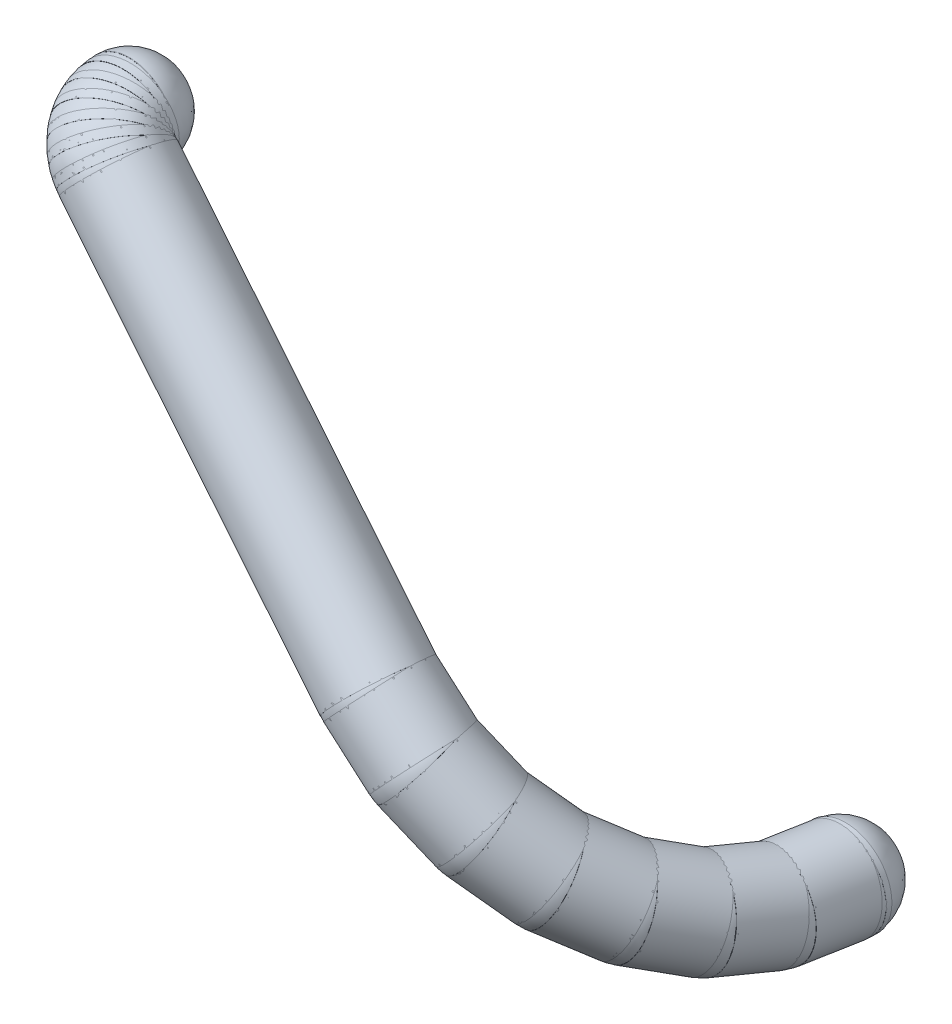
ISO-10303-21;
HEADER;
FILE_DESCRIPTION(('STEP AP214'),'2;1');
FILE_NAME('part.step','',(''),(''),'','','');
FILE_SCHEMA(('AUTOMOTIVE_DESIGN { 1 0 10303 214 1 1 1 1 }'));
ENDSEC;
DATA;
#1=APPLICATION_CONTEXT('core data for automotive mechanical design processes');
#2=APPLICATION_PROTOCOL_DEFINITION('international standard','automotive_design',2000,#1);
#3=PRODUCT_CONTEXT('',#1,'mechanical');
#4=PRODUCT('Part','Part','',(#3));
#5=PRODUCT_RELATED_PRODUCT_CATEGORY('part','',(#4));
#6=PRODUCT_DEFINITION_FORMATION('','',#4);
#7=PRODUCT_DEFINITION_CONTEXT('part definition',#1,'design');
#8=PRODUCT_DEFINITION('design','',#6,#7);
#9=PRODUCT_DEFINITION_SHAPE('','',#8);
#10=(LENGTH_UNIT() NAMED_UNIT(*) SI_UNIT(.MILLI.,.METRE.));
#11=(NAMED_UNIT(*) PLANE_ANGLE_UNIT() SI_UNIT($,.RADIAN.));
#12=(NAMED_UNIT(*) SI_UNIT($,.STERADIAN.) SOLID_ANGLE_UNIT());
#13=UNCERTAINTY_MEASURE_WITH_UNIT(LENGTH_MEASURE(1.E-05),#10,'distance_accuracy_value','');
#14=(GEOMETRIC_REPRESENTATION_CONTEXT(3) GLOBAL_UNCERTAINTY_ASSIGNED_CONTEXT((#13)) GLOBAL_UNIT_ASSIGNED_CONTEXT((#10,
#11,#12)) REPRESENTATION_CONTEXT('',''));
#15=CARTESIAN_POINT('',(0.,0.,0.));
#16=DIRECTION('',(0.,0.,1.));
#17=DIRECTION('',(1.,0.,0.));
#18=AXIS2_PLACEMENT_3D('',#15,#16,#17);
#19=CARTESIAN_POINT('',(51.3,-63.9,201.9));
#20=DIRECTION('',(0.,0.,1.));
#21=DIRECTION('',(1.,0.,0.));
#22=AXIS2_PLACEMENT_3D('',#19,#20,#21);
#23=PLANE('',#22);
#24=CARTESIAN_POINT('',(51.3,-63.9,201.9));
#25=DIRECTION('',(0.,0.,1.));
#26=DIRECTION('',(1.,0.,0.));
#27=AXIS2_PLACEMENT_3D('',#24,#25,#26);
#28=CIRCLE('',#27,2.25);
#29=CARTESIAN_POINT('',(53.55,-63.9,201.9));
#30=VERTEX_POINT('',#29);
#31=EDGE_CURVE('P0_E11',#30,#30,#28,.T.);
#32=ORIENTED_EDGE('',*,*,#31,.F.);
#33=EDGE_LOOP('',(#32));
#34=FACE_BOUND('',#33,.T.);
#35=ADVANCED_FACE('P0_F16',(#34),#23,.F.);
#36=CARTESIAN_POINT('',(51.3,-63.9,202.18));
#37=DIRECTION('',(0.,0.,1.));
#38=DIRECTION('',(1.,0.,0.));
#39=AXIS2_PLACEMENT_3D('',#36,#37,#38);
#40=PLANE('',#39);
#41=CARTESIAN_POINT('',(51.3,-63.9,202.18));
#42=DIRECTION('',(0.,0.,1.));
#43=DIRECTION('',(1.,0.,0.));
#44=AXIS2_PLACEMENT_3D('',#41,#42,#43);
#45=CIRCLE('',#44,2.25);
#46=CARTESIAN_POINT('',(53.55,-63.9,202.18));
#47=VERTEX_POINT('',#46);
#48=EDGE_CURVE('P0_E40',#47,#47,#45,.T.);
#49=ORIENTED_EDGE('',*,*,#48,.T.);
#50=EDGE_LOOP('',(#49));
#51=FACE_BOUND('',#50,.T.);
#52=ADVANCED_FACE('P0_F44',(#51),#40,.T.);
#53=CARTESIAN_POINT('',(51.3,-63.9,201.9));
#54=DIRECTION('',(0.,0.,1.));
#55=DIRECTION('',(1.,0.,0.));
#56=AXIS2_PLACEMENT_3D('',#53,#54,#55);
#57=CYLINDRICAL_SURFACE('',#56,2.25);
#58=ORIENTED_EDGE('',*,*,#48,.F.);
#59=DIRECTION('',(0.,0.,1.));
#60=VECTOR('',#59,1.);
#61=CARTESIAN_POINT('',(53.55,-63.9,201.9));
#62=LINE('',#61,#60);
#63=EDGE_CURVE('P0_E26',#30,#47,#62,.T.);
#64=ORIENTED_EDGE('',*,*,#63,.F.);
#65=ORIENTED_EDGE('',*,*,#31,.T.);
#66=ORIENTED_EDGE('',*,*,#63,.T.);
#67=EDGE_LOOP('',(#58,#64,#65,#66));
#68=FACE_BOUND('',#67,.T.);
#69=ADVANCED_FACE('P0_F18',(#68),#57,.T.);
#70=CLOSED_SHELL('',(#35,#52,#69));
#71=MANIFOLD_SOLID_BREP('P0_B1',#70);
#72=CARTESIAN_POINT('',(51.3,-63.9,202.18));
#73=DIRECTION('',(-0.0870078139300054,0.0809138814368578,0.992916201955605));
#74=DIRECTION('',(0.680997363034454,0.732285867363368,0.));
#75=AXIS2_PLACEMENT_3D('',#72,#73,#74);
#76=PLANE('',#75);
#77=CARTESIAN_POINT('',(51.3,-63.9,202.18));
#78=DIRECTION('',(-0.0870078139300494,0.0809138814368578,0.992916201955601));
#79=DIRECTION('',(0.996182588741021,0.,0.0872940426904318));
#80=AXIS2_PLACEMENT_3D('',#77,#78,#79);
#81=CIRCLE('',#80,2.25);
#82=CARTESIAN_POINT('',(53.541410824667,-63.9,202.37641159605));
#83=VERTEX_POINT('',#82);
#84=EDGE_CURVE('P1_E11',#83,#83,#81,.T.);
#85=ORIENTED_EDGE('',*,*,#84,.F.);
#86=EDGE_LOOP('',(#85));
#87=FACE_BOUND('',#86,.T.);
#88=ADVANCED_FACE('P1_F16',(#87),#76,.F.);
#89=CARTESIAN_POINT('',(51.042479503852,-63.66051595883,205.11877367343));
#90=DIRECTION('',(-0.0870078139300054,0.0809138814368578,0.992916201955605));
#91=DIRECTION('',(0.680997363034454,0.732285867363368,0.));
#92=AXIS2_PLACEMENT_3D('',#89,#90,#91);
#93=PLANE('',#92);
#94=CARTESIAN_POINT('',(51.042479503852,-63.66051595883,205.11877367343));
#95=DIRECTION('',(-0.0870078139300494,0.0809138814368578,0.992916201955601));
#96=DIRECTION('',(0.996182588741021,0.,0.0872940426904318));
#97=AXIS2_PLACEMENT_3D('',#94,#95,#96);
#98=CIRCLE('',#97,2.25);
#99=CARTESIAN_POINT('',(53.28389032852,-63.66051595883,205.31518526948));
#100=VERTEX_POINT('',#99);
#101=EDGE_CURVE('P1_E41',#100,#100,#98,.T.);
#102=ORIENTED_EDGE('',*,*,#101,.T.);
#103=EDGE_LOOP('',(#102));
#104=FACE_BOUND('',#103,.T.);
#105=ADVANCED_FACE('P1_F18',(#104),#93,.T.);
#106=CARTESIAN_POINT('',(51.3,-63.9,202.18));
#107=DIRECTION('',(-0.0870078139300494,0.0809138814368578,0.992916201955601));
#108=DIRECTION('',(0.996182588741021,0.,0.0872940426904318));
#109=AXIS2_PLACEMENT_3D('',#106,#107,#108);
#110=CYLINDRICAL_SURFACE('',#109,2.25);
#111=ORIENTED_EDGE('',*,*,#101,.F.);
#112=DIRECTION('',(-0.0870078139300054,0.0809138814368578,0.992916201955605));
#113=VECTOR('',#112,1.);
#114=CARTESIAN_POINT('',(53.541410824667,-63.9,202.37641159605));
#115=LINE('',#114,#113);
#116=EDGE_CURVE('P1_E25',#83,#100,#115,.T.);
#117=ORIENTED_EDGE('',*,*,#116,.F.);
#118=ORIENTED_EDGE('',*,*,#84,.T.);
#119=ORIENTED_EDGE('',*,*,#116,.T.);
#120=EDGE_LOOP('',(#111,#117,#118,#119));
#121=FACE_BOUND('',#120,.T.);
#122=ADVANCED_FACE('P1_F40',(#121),#110,.T.);
#123=CLOSED_SHELL('',(#88,#105,#122));
#124=MANIFOLD_SOLID_BREP('P1_B1',#123);
#125=CARTESIAN_POINT('',(51.042479503852,-63.66051595883,205.11877367343));
#126=DIRECTION('',(-0.256110139808954,0.238172464646956,0.936846558071829));
#127=DIRECTION('',(0.680997363034004,0.732285867363786,0.));
#128=AXIS2_PLACEMENT_3D('',#125,#126,#127);
#129=PLANE('',#128);
#130=CARTESIAN_POINT('',(51.042479503852,-63.66051595883,205.11877367343));
#131=DIRECTION('',(-0.256110139808665,0.238172464646956,0.936846558071908));
#132=DIRECTION('',(0.964605118063883,0.,0.263698627612968));
#133=AXIS2_PLACEMENT_3D('',#130,#131,#132);
#134=CIRCLE('',#133,2.25);
#135=CARTESIAN_POINT('',(53.212841019496,-63.66051595883,205.71209558556));
#136=VERTEX_POINT('',#135);
#137=EDGE_CURVE('P2_E11',#136,#136,#134,.T.);
#138=ORIENTED_EDGE('',*,*,#137,.F.);
#139=EDGE_LOOP('',(#138));
#140=FACE_BOUND('',#139,.T.);
#141=ADVANCED_FACE('P2_F16',(#140),#129,.F.);
#142=CARTESIAN_POINT('',(50.284460111191,-62.95558741857,207.8915957862));
#143=DIRECTION('',(-0.256110139808954,0.238172464646956,0.936846558071829));
#144=DIRECTION('',(0.680997363034004,0.732285867363786,0.));
#145=AXIS2_PLACEMENT_3D('',#142,#143,#144);
#146=PLANE('',#145);
#147=CARTESIAN_POINT('',(50.284460111191,-62.95558741857,207.8915957862));
#148=DIRECTION('',(-0.256110139808665,0.238172464646956,0.936846558071908));
#149=DIRECTION('',(0.964605118063883,0.,0.263698627612968));
#150=AXIS2_PLACEMENT_3D('',#147,#148,#149);
#151=CIRCLE('',#150,2.25);
#152=CARTESIAN_POINT('',(52.454821626834,-62.95558741857,208.48491769833));
#153=VERTEX_POINT('',#152);
#154=EDGE_CURVE('P2_E41',#153,#153,#151,.T.);
#155=ORIENTED_EDGE('',*,*,#154,.T.);
#156=EDGE_LOOP('',(#155));
#157=FACE_BOUND('',#156,.T.);
#158=ADVANCED_FACE('P2_F18',(#157),#146,.T.);
#159=CARTESIAN_POINT('',(51.042479503852,-63.66051595883,205.11877367343));
#160=DIRECTION('',(-0.256110139808665,0.238172464646956,0.936846558071908));
#161=DIRECTION('',(0.964605118063883,0.,0.263698627612968));
#162=AXIS2_PLACEMENT_3D('',#159,#160,#161);
#163=CYLINDRICAL_SURFACE('',#162,2.25);
#164=ORIENTED_EDGE('',*,*,#154,.F.);
#165=DIRECTION('',(-0.256110139808953,0.238172464646956,0.936846558071829));
#166=VECTOR('',#165,1.);
#167=CARTESIAN_POINT('',(53.212841019496,-63.66051595883,205.71209558556));
#168=LINE('',#167,#166);
#169=EDGE_CURVE('P2_E20',#136,#153,#168,.T.);
#170=ORIENTED_EDGE('',*,*,#169,.F.);
#171=ORIENTED_EDGE('',*,*,#137,.T.);
#172=ORIENTED_EDGE('',*,*,#169,.T.);
#173=EDGE_LOOP('',(#164,#170,#171,#172));
#174=FACE_BOUND('',#173,.T.);
#175=ADVANCED_FACE('P2_F40',(#174),#163,.T.);
#176=CLOSED_SHELL('',(#141,#158,#175));
#177=MANIFOLD_SOLID_BREP('P2_B1',#176);
#178=CARTESIAN_POINT('',(50.284460111191,-62.95558741857,207.8915957862));
#179=DIRECTION('',(-0.410750012254053,0.38198152890605,0.827873504231107));
#180=DIRECTION('',(0.68099736303494,0.732285867362916,0.));
#181=AXIS2_PLACEMENT_3D('',#178,#179,#180);
#182=PLANE('',#181);
#183=CARTESIAN_POINT('',(50.284460111191,-62.95558741857,207.8915957862));
#184=DIRECTION('',(-0.410750012254502,0.381981528906049,0.827873504230884));
#185=DIRECTION('',(0.895802224381682,0.,0.444452893783842));
#186=AXIS2_PLACEMENT_3D('',#183,#184,#185);
#187=CIRCLE('',#186,2.25);
#188=CARTESIAN_POINT('',(52.30001511605,-62.95558741857,208.89161479721));
#189=VERTEX_POINT('',#188);
#190=EDGE_CURVE('P3_E11',#189,#189,#187,.T.);
#191=ORIENTED_EDGE('',*,*,#190,.F.);
#192=EDGE_LOOP('',(#191));
#193=FACE_BOUND('',#192,.T.);
#194=ADVANCED_FACE('P3_F16',(#193),#182,.F.);
#195=CARTESIAN_POINT('',(49.068746922103,-61.82502145674,210.34188600644));
#196=DIRECTION('',(-0.410750012254053,0.38198152890605,0.827873504231107));
#197=DIRECTION('',(0.68099736303494,0.732285867362916,0.));
#198=AXIS2_PLACEMENT_3D('',#195,#196,#197);
#199=PLANE('',#198);
#200=CARTESIAN_POINT('',(49.068746922103,-61.82502145674,210.34188600644));
#201=DIRECTION('',(-0.410750012254502,0.381981528906049,0.827873504230884));
#202=DIRECTION('',(0.895802224381682,0.,0.444452893783842));
#203=AXIS2_PLACEMENT_3D('',#200,#201,#202);
#204=CIRCLE('',#203,2.25);
#205=CARTESIAN_POINT('',(51.084301926962,-61.82502145674,211.34190501745));
#206=VERTEX_POINT('',#205);
#207=EDGE_CURVE('P3_E20',#206,#206,#204,.T.);
#208=ORIENTED_EDGE('',*,*,#207,.T.);
#209=EDGE_LOOP('',(#208));
#210=FACE_BOUND('',#209,.T.);
#211=ADVANCED_FACE('P3_F44',(#210),#199,.T.);
#212=CARTESIAN_POINT('',(50.284460111191,-62.95558741857,207.8915957862));
#213=DIRECTION('',(-0.410750012254502,0.38198152890605,0.827873504230884));
#214=DIRECTION('',(0.895802224381682,0.,0.444452893783842));
#215=AXIS2_PLACEMENT_3D('',#212,#213,#214);
#216=CYLINDRICAL_SURFACE('',#215,2.25);
#217=ORIENTED_EDGE('',*,*,#207,.F.);
#218=DIRECTION('',(-0.410750012254053,0.38198152890605,0.827873504231107));
#219=VECTOR('',#218,1.);
#220=CARTESIAN_POINT('',(52.30001511605,-62.95558741857,208.89161479721));
#221=LINE('',#220,#219);
#222=EDGE_CURVE('P3_E27',#189,#206,#221,.T.);
#223=ORIENTED_EDGE('',*,*,#222,.F.);
#224=ORIENTED_EDGE('',*,*,#190,.T.);
#225=ORIENTED_EDGE('',*,*,#222,.T.);
#226=EDGE_LOOP('',(#217,#223,#224,#225));
#227=FACE_BOUND('',#226,.T.);
#228=ADVANCED_FACE('P3_F18',(#227),#216,.T.);
#229=CLOSED_SHELL('',(#194,#211,#228));
#230=MANIFOLD_SOLID_BREP('P3_B1',#229);
#231=CARTESIAN_POINT('',(49.068746922103,-61.82502145674,210.34188600644));
#232=DIRECTION('',(-0.542194969693797,0.504220224734812,0.672150712122749));
#233=DIRECTION('',(0.680997363034515,0.732285867363311,0.));
#234=AXIS2_PLACEMENT_3D('',#231,#232,#233);
#235=PLANE('',#234);
#236=CARTESIAN_POINT('',(49.068746922103,-61.82502145674,210.34188600644));
#237=DIRECTION('',(-0.542194969693866,0.504220224734812,0.672150712122694));
#238=DIRECTION('',(0.778334978489313,0.,0.627849234498252));
#239=AXIS2_PLACEMENT_3D('',#236,#237,#238);
#240=CIRCLE('',#239,2.25);
#241=CARTESIAN_POINT('',(50.820000623704,-61.82502145674,211.75454678406));
#242=VERTEX_POINT('',#241);
#243=EDGE_CURVE('P4_E11',#242,#242,#240,.T.);
#244=ORIENTED_EDGE('',*,*,#243,.F.);
#245=EDGE_LOOP('',(#244));
#246=FACE_BOUND('',#245,.T.);
#247=ADVANCED_FACE('P4_F16',(#246),#235,.F.);
#248=CARTESIAN_POINT('',(47.463990851383,-60.33266075284,212.33127726974));
#249=DIRECTION('',(-0.542194969693797,0.504220224734812,0.672150712122749));
#250=DIRECTION('',(0.680997363034515,0.732285867363311,0.));
#251=AXIS2_PLACEMENT_3D('',#248,#249,#250);
#252=PLANE('',#251);
#253=CARTESIAN_POINT('',(47.463990851383,-60.33266075284,212.33127726974));
#254=DIRECTION('',(-0.542194969693866,0.504220224734812,0.672150712122694));
#255=DIRECTION('',(0.778334978489313,0.,0.627849234498252));
#256=AXIS2_PLACEMENT_3D('',#253,#254,#255);
#257=CIRCLE('',#256,2.25);
#258=CARTESIAN_POINT('',(49.215244552984,-60.33266075284,213.74393804736));
#259=VERTEX_POINT('',#258);
#260=EDGE_CURVE('P4_E40',#259,#259,#257,.T.);
#261=ORIENTED_EDGE('',*,*,#260,.T.);
#262=EDGE_LOOP('',(#261));
#263=FACE_BOUND('',#262,.T.);
#264=ADVANCED_FACE('P4_F43',(#263),#252,.T.);
#265=CARTESIAN_POINT('',(49.068746922103,-61.82502145674,210.34188600644));
#266=DIRECTION('',(-0.542194969693866,0.504220224734812,0.672150712122694));
#267=DIRECTION('',(0.778334978489313,0.,0.627849234498252));
#268=AXIS2_PLACEMENT_3D('',#265,#266,#267);
#269=CYLINDRICAL_SURFACE('',#268,2.25);
#270=ORIENTED_EDGE('',*,*,#260,.F.);
#271=DIRECTION('',(-0.542194969693797,0.504220224734812,0.672150712122749));
#272=VECTOR('',#271,1.);
#273=CARTESIAN_POINT('',(50.820000623704,-61.82502145674,211.75454678406));
#274=LINE('',#273,#272);
#275=EDGE_CURVE('P4_E19',#242,#259,#274,.T.);
#276=ORIENTED_EDGE('',*,*,#275,.F.);
#277=ORIENTED_EDGE('',*,*,#243,.T.);
#278=ORIENTED_EDGE('',*,*,#275,.T.);
#279=EDGE_LOOP('',(#270,#276,#277,#278));
#280=FACE_BOUND('',#279,.T.);
#281=ADVANCED_FACE('P4_F39',(#280),#269,.T.);
#282=CLOSED_SHELL('',(#247,#264,#281));
#283=MANIFOLD_SOLID_BREP('P4_B1',#282);
#284=CARTESIAN_POINT('',(47.463990851383,-60.33266075284,212.33127726974));
#285=DIRECTION('',(-0.643022359601944,0.597985774104948,0.478471795427959));
#286=DIRECTION('',(0.596965423440808,0.,0.802266965053489));
#287=AXIS2_PLACEMENT_3D('',#284,#285,#286);
#288=PLANE('',#287);
#289=CARTESIAN_POINT('',(47.463990851383,-60.33266075284,212.33127726974));
#290=DIRECTION('',(-0.643022359602184,0.59798577410469,0.478471795427959));
#291=DIRECTION('',(-0.680997363034394,-0.732285867363424,0.));
#292=AXIS2_PLACEMENT_3D('',#289,#290,#291);
#293=CIRCLE('',#292,2.25);
#294=CARTESIAN_POINT('',(45.931746784556,-61.98030395441,212.33127726974));
#295=VERTEX_POINT('',#294);
#296=EDGE_CURVE('P5_E11',#295,#295,#293,.T.);
#297=ORIENTED_EDGE('',*,*,#296,.F.);
#298=EDGE_LOOP('',(#297));
#299=FACE_BOUND('',#298,.T.);
#300=ADVANCED_FACE('P5_F16',(#299),#288,.F.);
#301=CARTESIAN_POINT('',(45.560811934465,-58.56277841376,213.74742932076));
#302=DIRECTION('',(-0.643022359601944,0.597985774104948,0.478471795427959));
#303=DIRECTION('',(0.596965423440808,0.,0.802266965053489));
#304=AXIS2_PLACEMENT_3D('',#301,#302,#303);
#305=PLANE('',#304);
#306=CARTESIAN_POINT('',(45.560811934465,-58.56277841376,213.74742932076));
#307=DIRECTION('',(-0.643022359602184,0.59798577410469,0.478471795427959));
#308=DIRECTION('',(-0.680997363034394,-0.732285867363424,0.));
#309=AXIS2_PLACEMENT_3D('',#306,#307,#308);
#310=CIRCLE('',#309,2.25);
#311=CARTESIAN_POINT('',(44.028567867638,-60.21042161533,213.74742932076));
#312=VERTEX_POINT('',#311);
#313=EDGE_CURVE('P5_E40',#312,#312,#310,.T.);
#314=ORIENTED_EDGE('',*,*,#313,.T.);
#315=EDGE_LOOP('',(#314));
#316=FACE_BOUND('',#315,.T.);
#317=ADVANCED_FACE('P5_F43',(#316),#305,.T.);
#318=CARTESIAN_POINT('',(47.463990851383,-60.33266075284,212.33127726974));
#319=DIRECTION('',(-0.643022359602184,0.59798577410469,0.478471795427959));
#320=DIRECTION('',(-0.680997363034394,-0.732285867363424,0.));
#321=AXIS2_PLACEMENT_3D('',#318,#319,#320);
#322=CYLINDRICAL_SURFACE('',#321,2.25);
#323=ORIENTED_EDGE('',*,*,#313,.F.);
#324=DIRECTION('',(-0.643022359601944,0.597985774104948,0.478471795427959));
#325=VECTOR('',#324,1.);
#326=CARTESIAN_POINT('',(45.931746784556,-61.98030395441,212.33127726974));
#327=LINE('',#326,#325);
#328=EDGE_CURVE('P5_E20',#295,#312,#327,.T.);
#329=ORIENTED_EDGE('',*,*,#328,.F.);
#330=ORIENTED_EDGE('',*,*,#296,.T.);
#331=ORIENTED_EDGE('',*,*,#328,.T.);
#332=EDGE_LOOP('',(#323,#329,#330,#331));
#333=FACE_BOUND('',#332,.T.);
#334=ADVANCED_FACE('P5_F18',(#333),#322,.T.);
#335=CLOSED_SHELL('',(#300,#317,#334));
#336=MANIFOLD_SOLID_BREP('P5_B1',#335);
#337=CARTESIAN_POINT('',(45.560811934465,-58.56277841376,213.74742932076));
#338=DIRECTION('',(-0.707538493191446,0.657983267987415,0.257773737415163));
#339=DIRECTION('',(0.342314204001418,0.,0.939585539341084));
#340=AXIS2_PLACEMENT_3D('',#337,#338,#339);
#341=PLANE('',#340);
#342=CARTESIAN_POINT('',(45.560811934465,-58.56277841376,213.74742932076));
#343=DIRECTION('',(-0.707538493191501,0.657983267987355,0.257773737415163));
#344=DIRECTION('',(-0.680997363034394,-0.732285867363424,0.));
#345=AXIS2_PLACEMENT_3D('',#342,#343,#344);
#346=CIRCLE('',#345,2.25);
#347=CARTESIAN_POINT('',(44.028567867638,-60.21042161533,213.74742932076));
#348=VERTEX_POINT('',#347);
#349=EDGE_CURVE('P6_E11',#348,#348,#346,.T.);
#350=ORIENTED_EDGE('',*,*,#349,.F.);
#351=EDGE_LOOP('',(#350));
#352=FACE_BOUND('',#351,.T.);
#353=ADVANCED_FACE('P6_F16',(#352),#341,.F.);
#354=CARTESIAN_POINT('',(43.466682044514,-56.61531909976,214.51037252958));
#355=DIRECTION('',(-0.707538493191446,0.657983267987415,0.257773737415163));
#356=DIRECTION('',(0.342314204001418,0.,0.939585539341084));
#357=AXIS2_PLACEMENT_3D('',#354,#355,#356);
#358=PLANE('',#357);
#359=CARTESIAN_POINT('',(43.466682044514,-56.61531909976,214.51037252958));
#360=DIRECTION('',(-0.707538493191501,0.657983267987355,0.257773737415163));
#361=DIRECTION('',(-0.680997363034394,-0.732285867363424,0.));
#362=AXIS2_PLACEMENT_3D('',#359,#360,#361);
#363=CIRCLE('',#362,2.25);
#364=CARTESIAN_POINT('',(41.934437977687,-58.26296230133,214.51037252958));
#365=VERTEX_POINT('',#364);
#366=EDGE_CURVE('P6_E41',#365,#365,#363,.T.);
#367=ORIENTED_EDGE('',*,*,#366,.T.);
#368=EDGE_LOOP('',(#367));
#369=FACE_BOUND('',#368,.T.);
#370=ADVANCED_FACE('P6_F18',(#369),#358,.T.);
#371=CARTESIAN_POINT('',(45.560811934465,-58.56277841376,213.74742932076));
#372=DIRECTION('',(-0.707538493191501,0.657983267987355,0.257773737415163));
#373=DIRECTION('',(-0.680997363034394,-0.732285867363424,0.));
#374=AXIS2_PLACEMENT_3D('',#371,#372,#373);
#375=CYLINDRICAL_SURFACE('',#374,2.25);
#376=ORIENTED_EDGE('',*,*,#366,.F.);
#377=DIRECTION('',(-0.707538493191446,0.657983267987415,0.257773737415163));
#378=VECTOR('',#377,1.);
#379=CARTESIAN_POINT('',(44.028567867638,-60.21042161533,213.74742932076));
#380=LINE('',#379,#378);
#381=EDGE_CURVE('P6_E26',#348,#365,#380,.T.);
#382=ORIENTED_EDGE('',*,*,#381,.F.);
#383=ORIENTED_EDGE('',*,*,#349,.T.);
#384=ORIENTED_EDGE('',*,*,#381,.T.);
#385=EDGE_LOOP('',(#376,#382,#383,#384));
#386=FACE_BOUND('',#385,.T.);
#387=ADVANCED_FACE('P6_F40',(#386),#375,.T.);
#388=CLOSED_SHELL('',(#353,#370,#387));
#389=MANIFOLD_SOLID_BREP('P6_B1',#388);
#390=CARTESIAN_POINT('',(43.466682044514,-56.61531909976,214.51037252958));
#391=DIRECTION('',(-0.732100166103101,0.680824668088094,0.0225192831713131));
#392=DIRECTION('',(0.0307452972400076,0.,0.999527251603289));
#393=AXIS2_PLACEMENT_3D('',#390,#391,#392);
#394=PLANE('',#393);
#395=CARTESIAN_POINT('',(43.466682044514,-56.61531909976,214.51037252958));
#396=DIRECTION('',(-0.732100166103135,0.680824668088056,0.0225192831713131));
#397=DIRECTION('',(-0.680997363034394,-0.732285867363424,0.));
#398=AXIS2_PLACEMENT_3D('',#395,#396,#397);
#399=CIRCLE('',#398,2.25);
#400=CARTESIAN_POINT('',(41.934437977687,-58.26296230133,214.51037252958));
#401=VERTEX_POINT('',#400);
#402=EDGE_CURVE('P7_E11',#401,#401,#399,.T.);
#403=ORIENTED_EDGE('',*,*,#402,.F.);
#404=EDGE_LOOP('',(#403));
#405=FACE_BOUND('',#404,.T.);
#406=ADVANCED_FACE('P7_F16',(#405),#394,.F.);
#407=CARTESIAN_POINT('',(41.2998559919,-54.60025518312,214.5770237499));
#408=DIRECTION('',(-0.732100166103101,0.680824668088094,0.0225192831713131));
#409=DIRECTION('',(0.0307452972400076,0.,0.999527251603289));
#410=AXIS2_PLACEMENT_3D('',#407,#408,#409);
#411=PLANE('',#410);
#412=CARTESIAN_POINT('',(41.2998559919,-54.60025518312,214.5770237499));
#413=DIRECTION('',(-0.732100166103135,0.680824668088056,0.0225192831713131));
#414=DIRECTION('',(-0.680997363034394,-0.732285867363424,0.));
#415=AXIS2_PLACEMENT_3D('',#412,#413,#414);
#416=CIRCLE('',#415,2.25);
#417=CARTESIAN_POINT('',(39.767611925072,-56.24789838469,214.5770237499));
#418=VERTEX_POINT('',#417);
#419=EDGE_CURVE('P7_E19',#418,#418,#416,.T.);
#420=ORIENTED_EDGE('',*,*,#419,.T.);
#421=EDGE_LOOP('',(#420));
#422=FACE_BOUND('',#421,.T.);
#423=ADVANCED_FACE('P7_F44',(#422),#411,.T.);
#424=CARTESIAN_POINT('',(43.466682044514,-56.61531909976,214.51037252958));
#425=DIRECTION('',(-0.732100166103135,0.680824668088056,0.0225192831713131));
#426=DIRECTION('',(-0.680997363034394,-0.732285867363424,0.));
#427=AXIS2_PLACEMENT_3D('',#424,#425,#426);
#428=CYLINDRICAL_SURFACE('',#427,2.25);
#429=ORIENTED_EDGE('',*,*,#419,.F.);
#430=DIRECTION('',(-0.732100166103101,0.680824668088094,0.0225192831713131));
#431=VECTOR('',#430,1.);
#432=CARTESIAN_POINT('',(41.934437977687,-58.26296230133,214.51037252958));
#433=LINE('',#432,#431);
#434=EDGE_CURVE('P7_E25',#401,#418,#433,.T.);
#435=ORIENTED_EDGE('',*,*,#434,.F.);
#436=ORIENTED_EDGE('',*,*,#402,.T.);
#437=ORIENTED_EDGE('',*,*,#434,.T.);
#438=EDGE_LOOP('',(#429,#435,#436,#437));
#439=FACE_BOUND('',#438,.T.);
#440=ADVANCED_FACE('P7_F40',(#439),#428,.T.);
#441=CLOSED_SHELL('',(#406,#423,#440));
#442=MANIFOLD_SOLID_BREP('P7_B1',#441);
#443=CARTESIAN_POINT('',(41.2998559919,-54.60025518312,214.5770237499));
#444=DIRECTION('',(-0.728873469978224,0.677823966244208,-0.0964268403862397));
#445=DIRECTION('',(-0.131152968355863,0.,0.991362143160332));
#446=AXIS2_PLACEMENT_3D('',#443,#444,#445);
#447=PLANE('',#446);
#448=CARTESIAN_POINT('',(41.2998559919,-54.60025518312,214.5770237499));
#449=DIRECTION('',(-0.728873469978195,0.67782396624424,-0.0964268403862396));
#450=DIRECTION('',(-0.680997363034394,-0.732285867363424,0.));
#451=AXIS2_PLACEMENT_3D('',#448,#449,#450);
#452=CIRCLE('',#451,2.25);
#453=CARTESIAN_POINT('',(39.767611925072,-56.24789838469,214.5770237499));
#454=VERTEX_POINT('',#453);
#455=EDGE_CURVE('P8_E11',#454,#454,#452,.T.);
#456=ORIENTED_EDGE('',*,*,#455,.F.);
#457=EDGE_LOOP('',(#456));
#458=FACE_BOUND('',#457,.T.);
#459=ADVANCED_FACE('P8_F16',(#458),#447,.F.);
#460=CARTESIAN_POINT('',(26.671444000868,-40.99640123037,212.64174745536));
#461=DIRECTION('',(-0.728873469978224,0.677823966244208,-0.0964268403862397));
#462=DIRECTION('',(-0.131152968355863,0.,0.991362143160332));
#463=AXIS2_PLACEMENT_3D('',#460,#461,#462);
#464=PLANE('',#463);
#465=CARTESIAN_POINT('',(26.671444000868,-40.99640123037,212.64174745536));
#466=DIRECTION('',(-0.728873469978195,0.67782396624424,-0.0964268403862396));
#467=DIRECTION('',(-0.680997363034394,-0.732285867363424,0.));
#468=AXIS2_PLACEMENT_3D('',#465,#466,#467);
#469=CIRCLE('',#468,2.25);
#470=CARTESIAN_POINT('',(25.13919993404,-42.64404443194,212.64174745536));
#471=VERTEX_POINT('',#470);
#472=EDGE_CURVE('P8_E41',#471,#471,#469,.T.);
#473=ORIENTED_EDGE('',*,*,#472,.T.);
#474=EDGE_LOOP('',(#473));
#475=FACE_BOUND('',#474,.T.);
#476=ADVANCED_FACE('P8_F18',(#475),#464,.T.);
#477=CARTESIAN_POINT('',(41.2998559919,-54.60025518312,214.5770237499));
#478=DIRECTION('',(-0.728873469978195,0.67782396624424,-0.0964268403862396));
#479=DIRECTION('',(-0.680997363034394,-0.732285867363424,0.));
#480=AXIS2_PLACEMENT_3D('',#477,#478,#479);
#481=CYLINDRICAL_SURFACE('',#480,2.25);
#482=ORIENTED_EDGE('',*,*,#472,.F.);
#483=DIRECTION('',(-0.728873469978224,0.677823966244208,-0.0964268403862396));
#484=VECTOR('',#483,1.);
#485=CARTESIAN_POINT('',(39.767611925072,-56.24789838469,214.5770237499));
#486=LINE('',#485,#484);
#487=EDGE_CURVE('P8_E25',#454,#471,#486,.T.);
#488=ORIENTED_EDGE('',*,*,#487,.F.);
#489=ORIENTED_EDGE('',*,*,#455,.T.);
#490=ORIENTED_EDGE('',*,*,#487,.T.);
#491=EDGE_LOOP('',(#482,#488,#489,#490));
#492=FACE_BOUND('',#491,.T.);
#493=ADVANCED_FACE('P8_F40',(#492),#481,.T.);
#494=CLOSED_SHELL('',(#459,#476,#493));
#495=MANIFOLD_SOLID_BREP('P8_B1',#494);
#496=CARTESIAN_POINT('',(26.671444000868,-40.99640123037,212.64174745536));
#497=DIRECTION('',(-0.714727119705637,0.664668410932662,-0.21767188120089));
#498=DIRECTION('',(-0.291340746008024,0.,0.95661934420933));
#499=AXIS2_PLACEMENT_3D('',#496,#497,#498);
#500=PLANE('',#499);
#501=CARTESIAN_POINT('',(26.671444000868,-40.99640123037,212.64174745536));
#502=DIRECTION('',(-0.714727119705764,0.664668410932525,-0.21767188120089));
#503=DIRECTION('',(-0.680997363034394,-0.732285867363424,0.));
#504=AXIS2_PLACEMENT_3D('',#501,#502,#503);
#505=CIRCLE('',#504,2.25);
#506=CARTESIAN_POINT('',(25.13919993404,-42.64404443194,212.64174745536));
#507=VERTEX_POINT('',#506);
#508=EDGE_CURVE('P9_E11',#507,#507,#505,.T.);
#509=ORIENTED_EDGE('',*,*,#508,.F.);
#510=EDGE_LOOP('',(#509));
#511=FACE_BOUND('',#510,.T.);
#512=ADVANCED_FACE('P9_F16',(#511),#500,.F.);
#513=CARTESIAN_POINT('',(26.387793430923,-40.73261723731,212.55536098497));
#514=DIRECTION('',(-0.714727119705637,0.664668410932662,-0.21767188120089));
#515=DIRECTION('',(-0.291340746008024,0.,0.95661934420933));
#516=AXIS2_PLACEMENT_3D('',#513,#514,#515);
#517=PLANE('',#516);
#518=CARTESIAN_POINT('',(26.387793430923,-40.73261723731,212.55536098497));
#519=DIRECTION('',(-0.714727119705764,0.664668410932525,-0.21767188120089));
#520=DIRECTION('',(-0.680997363034394,-0.732285867363424,0.));
#521=AXIS2_PLACEMENT_3D('',#518,#519,#520);
#522=CIRCLE('',#521,2.25);
#523=CARTESIAN_POINT('',(24.855549364095,-42.38026043888,212.55536098497));
#524=VERTEX_POINT('',#523);
#525=EDGE_CURVE('P9_E20',#524,#524,#522,.T.);
#526=ORIENTED_EDGE('',*,*,#525,.T.);
#527=EDGE_LOOP('',(#526));
#528=FACE_BOUND('',#527,.T.);
#529=ADVANCED_FACE('P9_F44',(#528),#517,.T.);
#530=CARTESIAN_POINT('',(26.671444000868,-40.99640123037,212.64174745536));
#531=DIRECTION('',(-0.714727119705764,0.664668410932525,-0.21767188120089));
#532=DIRECTION('',(-0.680997363034394,-0.732285867363424,0.));
#533=AXIS2_PLACEMENT_3D('',#530,#531,#532);
#534=CYLINDRICAL_SURFACE('',#533,2.25);
#535=ORIENTED_EDGE('',*,*,#525,.F.);
#536=DIRECTION('',(-0.714727119705637,0.664668410932662,-0.21767188120089));
#537=VECTOR('',#536,1.);
#538=CARTESIAN_POINT('',(25.13919993404,-42.64404443194,212.64174745536));
#539=LINE('',#538,#537);
#540=EDGE_CURVE('P9_E27',#507,#524,#539,.T.);
#541=ORIENTED_EDGE('',*,*,#540,.F.);
#542=ORIENTED_EDGE('',*,*,#508,.T.);
#543=ORIENTED_EDGE('',*,*,#540,.T.);
#544=EDGE_LOOP('',(#535,#541,#542,#543));
#545=FACE_BOUND('',#544,.T.);
#546=ADVANCED_FACE('P9_F18',(#545),#534,.T.);
#547=CLOSED_SHELL('',(#512,#529,#546));
#548=MANIFOLD_SOLID_BREP('P9_B1',#547);
#549=CARTESIAN_POINT('',(26.387793430923,-40.73261723731,212.55536098497));
#550=DIRECTION('',(-0.654489629139895,0.608649888576903,-0.448540565036928));
#551=DIRECTION('',(-0.56531203107701,0.,0.824877146925277));
#552=AXIS2_PLACEMENT_3D('',#549,#550,#551);
#553=PLANE('',#552);
#554=CARTESIAN_POINT('',(26.387793430923,-40.73261723731,212.55536098497));
#555=DIRECTION('',(-0.654489629139596,0.608649888577224,-0.448540565036929));
#556=DIRECTION('',(-0.680997363034394,-0.732285867363424,0.));
#557=AXIS2_PLACEMENT_3D('',#554,#555,#556);
#558=CIRCLE('',#557,2.25);
#559=CARTESIAN_POINT('',(24.855549364095,-42.38026043888,212.55536098497));
#560=VERTEX_POINT('',#559);
#561=EDGE_CURVE('P10_E11',#560,#560,#558,.T.);
#562=ORIENTED_EDGE('',*,*,#561,.F.);
#563=EDGE_LOOP('',(#562));
#564=FACE_BOUND('',#563,.T.);
#565=ADVANCED_FACE('P10_F16',(#564),#553,.F.);
#566=CARTESIAN_POINT('',(26.128049045674,-40.49106506582,212.37735068788));
#567=DIRECTION('',(-0.654489629139895,0.608649888576903,-0.448540565036928));
#568=DIRECTION('',(-0.56531203107701,0.,0.824877146925277));
#569=AXIS2_PLACEMENT_3D('',#566,#567,#568);
#570=PLANE('',#569);
#571=CARTESIAN_POINT('',(26.128049045674,-40.49106506582,212.37735068788));
#572=DIRECTION('',(-0.654489629139596,0.608649888577224,-0.448540565036929));
#573=DIRECTION('',(-0.680997363034394,-0.732285867363424,0.));
#574=AXIS2_PLACEMENT_3D('',#571,#572,#573);
#575=CIRCLE('',#574,2.25);
#576=CARTESIAN_POINT('',(24.595804978846,-42.13870826738,212.37735068788));
#577=VERTEX_POINT('',#576);
#578=EDGE_CURVE('P10_E40',#577,#577,#575,.T.);
#579=ORIENTED_EDGE('',*,*,#578,.T.);
#580=EDGE_LOOP('',(#579));
#581=FACE_BOUND('',#580,.T.);
#582=ADVANCED_FACE('P10_F43',(#581),#570,.T.);
#583=CARTESIAN_POINT('',(26.387793430923,-40.73261723731,212.55536098497));
#584=DIRECTION('',(-0.654489629139596,0.608649888577224,-0.448540565036928));
#585=DIRECTION('',(-0.680997363034394,-0.732285867363424,0.));
#586=AXIS2_PLACEMENT_3D('',#583,#584,#585);
#587=CYLINDRICAL_SURFACE('',#586,2.25);
#588=ORIENTED_EDGE('',*,*,#578,.F.);
#589=DIRECTION('',(-0.654489629139895,0.608649888576902,-0.448540565036928));
#590=VECTOR('',#589,1.);
#591=CARTESIAN_POINT('',(24.855549364095,-42.38026043888,212.55536098497));
#592=LINE('',#591,#590);
#593=EDGE_CURVE('P10_E19',#560,#577,#592,.T.);
#594=ORIENTED_EDGE('',*,*,#593,.F.);
#595=ORIENTED_EDGE('',*,*,#561,.T.);
#596=ORIENTED_EDGE('',*,*,#593,.T.);
#597=EDGE_LOOP('',(#588,#594,#595,#596));
#598=FACE_BOUND('',#597,.T.);
#599=ADVANCED_FACE('P10_F39',(#598),#587,.T.);
#600=CLOSED_SHELL('',(#565,#582,#599));
#601=MANIFOLD_SOLID_BREP('P10_B1',#600);
#602=CARTESIAN_POINT('',(26.128049045674,-40.49106506582,212.37735068788));
#603=DIRECTION('',(-0.554938923572902,0.516071605967909,-0.652466772040885));
#604=DIRECTION('',(-0.761742154682198,0.,0.64788030513369));
#605=AXIS2_PLACEMENT_3D('',#602,#603,#604);
#606=PLANE('',#605);
#607=CARTESIAN_POINT('',(26.128049045674,-40.49106506582,212.37735068788));
#608=DIRECTION('',(-0.55493892357314,0.516071605967909,-0.652466772040683));
#609=DIRECTION('',(-0.761742154681962,0.,0.647880305133967));
#610=AXIS2_PLACEMENT_3D('',#607,#608,#609);
#611=CIRCLE('',#610,2.25);
#612=CARTESIAN_POINT('',(24.414129197639,-40.49106506582,213.83508137443));
#613=VERTEX_POINT('',#612);
#614=EDGE_CURVE('P11_E11',#613,#613,#611,.T.);
#615=ORIENTED_EDGE('',*,*,#614,.F.);
#616=EDGE_LOOP('',(#615));
#617=FACE_BOUND('',#616,.T.);
#618=ADVANCED_FACE('P11_F16',(#617),#606,.F.);
#619=CARTESIAN_POINT('',(25.907812905731,-40.28625402517,212.11840910493));
#620=DIRECTION('',(-0.554938923572902,0.516071605967909,-0.652466772040885));
#621=DIRECTION('',(-0.761742154682198,0.,0.64788030513369));
#622=AXIS2_PLACEMENT_3D('',#619,#620,#621);
#623=PLANE('',#622);
#624=CARTESIAN_POINT('',(25.907812905731,-40.28625402517,212.11840910493));
#625=DIRECTION('',(-0.55493892357314,0.516071605967909,-0.652466772040683));
#626=DIRECTION('',(-0.761742154681962,0.,0.647880305133967));
#627=AXIS2_PLACEMENT_3D('',#624,#625,#626);
#628=CIRCLE('',#627,2.25);
#629=CARTESIAN_POINT('',(24.193893057697,-40.28625402517,213.57613979148));
#630=VERTEX_POINT('',#629);
#631=EDGE_CURVE('P11_E19',#630,#630,#628,.T.);
#632=ORIENTED_EDGE('',*,*,#631,.T.);
#633=EDGE_LOOP('',(#632));
#634=FACE_BOUND('',#633,.T.);
#635=ADVANCED_FACE('P11_F44',(#634),#623,.T.);
#636=CARTESIAN_POINT('',(26.128049045674,-40.49106506582,212.37735068788));
#637=DIRECTION('',(-0.55493892357314,0.516071605967909,-0.652466772040683));
#638=DIRECTION('',(-0.761742154681962,0.,0.647880305133967));
#639=AXIS2_PLACEMENT_3D('',#636,#637,#638);
#640=CYLINDRICAL_SURFACE('',#639,2.25);
#641=ORIENTED_EDGE('',*,*,#631,.F.);
#642=DIRECTION('',(-0.554938923572902,0.516071605967909,-0.652466772040885));
#643=VECTOR('',#642,1.);
#644=CARTESIAN_POINT('',(24.414129197639,-40.49106506582,213.83508137443));
#645=LINE('',#644,#643);
#646=EDGE_CURVE('P11_E25',#613,#630,#645,.T.);
#647=ORIENTED_EDGE('',*,*,#646,.F.);
#648=ORIENTED_EDGE('',*,*,#614,.T.);
#649=ORIENTED_EDGE('',*,*,#646,.T.);
#650=EDGE_LOOP('',(#641,#647,#648,#649));
#651=FACE_BOUND('',#650,.T.);
#652=ADVANCED_FACE('P11_F40',(#651),#640,.T.);
#653=CLOSED_SHELL('',(#618,#635,#652));
#654=MANIFOLD_SOLID_BREP('P11_B1',#653);
#655=CARTESIAN_POINT('',(25.907812905731,-40.28625402517,212.11840910493));
#656=DIRECTION('',(-0.422054713174926,0.39249446089093,-0.817201270958856));
#657=DIRECTION('',(-0.888499472299949,0.,0.458877639161807));
#658=AXIS2_PLACEMENT_3D('',#655,#656,#657);
#659=PLANE('',#658);
#660=CARTESIAN_POINT('',(25.907812905731,-40.28625402517,212.11840910493));
#661=DIRECTION('',(-0.422054713175047,0.39249446089093,-0.817201270958793));
#662=DIRECTION('',(-0.888499472299881,0.,0.458877639161938));
#663=AXIS2_PLACEMENT_3D('',#660,#661,#662);
#664=CIRCLE('',#663,2.25);
#665=CARTESIAN_POINT('',(23.908689093057,-40.28625402517,213.15088379304));
#666=VERTEX_POINT('',#665);
#667=EDGE_CURVE('P12_E11',#666,#666,#664,.T.);
#668=ORIENTED_EDGE('',*,*,#667,.F.);
#669=EDGE_LOOP('',(#668));
#670=FACE_BOUND('',#669,.T.);
#671=ADVANCED_FACE('P12_F16',(#670),#659,.F.);
#672=CARTESIAN_POINT('',(25.740313930753,-40.13048649591,211.7940900748));
#673=DIRECTION('',(-0.422054713174926,0.39249446089093,-0.817201270958856));
#674=DIRECTION('',(-0.888499472299949,0.,0.458877639161807));
#675=AXIS2_PLACEMENT_3D('',#672,#673,#674);
#676=PLANE('',#675);
#677=CARTESIAN_POINT('',(25.740313930753,-40.13048649591,211.7940900748));
#678=DIRECTION('',(-0.422054713175047,0.39249446089093,-0.817201270958793));
#679=DIRECTION('',(-0.888499472299881,0.,0.458877639161938));
#680=AXIS2_PLACEMENT_3D('',#677,#678,#679);
#681=CIRCLE('',#680,2.25);
#682=CARTESIAN_POINT('',(23.741190118078,-40.13048649591,212.82656476291));
#683=VERTEX_POINT('',#682);
#684=EDGE_CURVE('P12_E40',#683,#683,#681,.T.);
#685=ORIENTED_EDGE('',*,*,#684,.T.);
#686=EDGE_LOOP('',(#685));
#687=FACE_BOUND('',#686,.T.);
#688=ADVANCED_FACE('P12_F44',(#687),#676,.T.);
#689=CARTESIAN_POINT('',(25.907812905731,-40.28625402517,212.11840910493));
#690=DIRECTION('',(-0.422054713175047,0.39249446089093,-0.817201270958793));
#691=DIRECTION('',(-0.888499472299881,0.,0.458877639161938));
#692=AXIS2_PLACEMENT_3D('',#689,#690,#691);
#693=CYLINDRICAL_SURFACE('',#692,2.25);
#694=ORIENTED_EDGE('',*,*,#684,.F.);
#695=DIRECTION('',(-0.422054713174926,0.39249446089093,-0.817201270958856));
#696=VECTOR('',#695,1.);
#697=CARTESIAN_POINT('',(23.908689093057,-40.28625402517,213.15088379304));
#698=LINE('',#697,#696);
#699=EDGE_CURVE('P12_E24',#666,#683,#698,.T.);
#700=ORIENTED_EDGE('',*,*,#699,.F.);
#701=ORIENTED_EDGE('',*,*,#667,.T.);
#702=ORIENTED_EDGE('',*,*,#699,.T.);
#703=EDGE_LOOP('',(#694,#700,#701,#702));
#704=FACE_BOUND('',#703,.T.);
#705=ADVANCED_FACE('P12_F39',(#704),#693,.T.);
#706=CLOSED_SHELL('',(#671,#688,#705));
#707=MANIFOLD_SOLID_BREP('P12_B1',#706);
#708=CARTESIAN_POINT('',(25.740313930753,-40.13048649591,211.7940900748));
#709=DIRECTION('',(-0.26381895106094,0.245341359157944,-0.932848958056789));
#710=DIRECTION('',(-0.962258708944332,0.,0.2721363207306));
#711=AXIS2_PLACEMENT_3D('',#708,#709,#710);
#712=PLANE('',#711);
#713=CARTESIAN_POINT('',(25.740313930753,-40.13048649591,211.7940900748));
#714=DIRECTION('',(-0.263818951061384,0.245341359157944,-0.932848958056664));
#715=DIRECTION('',(-0.962258708944202,0.,0.272136320731057));
#716=AXIS2_PLACEMENT_3D('',#713,#714,#715);
#717=CIRCLE('',#716,2.25);
#718=CARTESIAN_POINT('',(23.575231835628,-40.13048649591,212.40639679644));
#719=VERTEX_POINT('',#718);
#720=EDGE_CURVE('P13_E11',#719,#719,#717,.T.);
#721=ORIENTED_EDGE('',*,*,#720,.F.);
#722=EDGE_LOOP('',(#721));
#723=FACE_BOUND('',#722,.T.);
#724=ADVANCED_FACE('P13_F16',(#723),#712,.F.);
#725=CARTESIAN_POINT('',(25.635613278199,-40.03311896299,211.42387446197));
#726=DIRECTION('',(-0.26381895106094,0.245341359157944,-0.932848958056789));
#727=DIRECTION('',(-0.962258708944332,0.,0.2721363207306));
#728=AXIS2_PLACEMENT_3D('',#725,#726,#727);
#729=PLANE('',#728);
#730=CARTESIAN_POINT('',(25.635613278199,-40.03311896299,211.42387446197));
#731=DIRECTION('',(-0.263818951061384,0.245341359157944,-0.932848958056664));
#732=DIRECTION('',(-0.962258708944202,0.,0.272136320731057));
#733=AXIS2_PLACEMENT_3D('',#730,#731,#732);
#734=CIRCLE('',#733,2.25);
#735=CARTESIAN_POINT('',(23.470531183074,-40.03311896299,212.03618118362));
#736=VERTEX_POINT('',#735);
#737=EDGE_CURVE('P13_E20',#736,#736,#734,.T.);
#738=ORIENTED_EDGE('',*,*,#737,.T.);
#739=EDGE_LOOP('',(#738));
#740=FACE_BOUND('',#739,.T.);
#741=ADVANCED_FACE('P13_F44',(#740),#729,.T.);
#742=CARTESIAN_POINT('',(25.740313930753,-40.13048649591,211.7940900748));
#743=DIRECTION('',(-0.263818951061384,0.245341359157944,-0.932848958056664));
#744=DIRECTION('',(-0.962258708944202,0.,0.272136320731057));
#745=AXIS2_PLACEMENT_3D('',#742,#743,#744);
#746=CYLINDRICAL_SURFACE('',#745,2.25);
#747=ORIENTED_EDGE('',*,*,#737,.F.);
#748=DIRECTION('',(-0.26381895106094,0.245341359157944,-0.932848958056789));
#749=VECTOR('',#748,1.);
#750=CARTESIAN_POINT('',(23.575231835628,-40.13048649591,212.40639679644));
#751=LINE('',#750,#749);
#752=EDGE_CURVE('P13_E27',#719,#736,#751,.T.);
#753=ORIENTED_EDGE('',*,*,#752,.F.);
#754=ORIENTED_EDGE('',*,*,#720,.T.);
#755=ORIENTED_EDGE('',*,*,#752,.T.);
#756=EDGE_LOOP('',(#747,#753,#754,#755));
#757=FACE_BOUND('',#756,.T.);
#758=ADVANCED_FACE('P13_F18',(#757),#746,.T.);
#759=CLOSED_SHELL('',(#724,#741,#758));
#760=MANIFOLD_SOLID_BREP('P13_B1',#759);
#761=CARTESIAN_POINT('',(25.635613278199,-40.03311896299,211.42387446197));
#762=DIRECTION('',(-0.0897363814762775,0.0834513430849469,-0.992463226108082));
#763=DIRECTION('',(-0.995937201385419,0.,0.0900504908180903));
#764=AXIS2_PLACEMENT_3D('',#761,#762,#763);
#765=PLANE('',#764);
#766=CARTESIAN_POINT('',(25.635613278199,-40.03311896299,211.42387446197));
#767=DIRECTION('',(-0.0897363814763047,0.0834513430849469,-0.99246322610808));
#768=DIRECTION('',(-0.995937201385417,0.,0.0900504908181177));
#769=AXIS2_PLACEMENT_3D('',#766,#767,#768);
#770=CIRCLE('',#769,2.25);
#771=CARTESIAN_POINT('',(23.394754575082,-40.03311896299,211.62648806631));
#772=VERTEX_POINT('',#771);
#773=EDGE_CURVE('P14_E11',#772,#772,#770,.T.);
#774=ORIENTED_EDGE('',*,*,#773,.F.);
#775=EDGE_LOOP('',(#774));
#776=FACE_BOUND('',#775,.T.);
#777=ADVANCED_FACE('P14_F16',(#776),#765,.F.);
#778=CARTESIAN_POINT('',(25.6,-40.,211.03));
#779=DIRECTION('',(-0.0897363814762775,0.0834513430849469,-0.992463226108082));
#780=DIRECTION('',(-0.995937201385419,0.,0.0900504908180903));
#781=AXIS2_PLACEMENT_3D('',#778,#779,#780);
#782=PLANE('',#781);
#783=CARTESIAN_POINT('',(25.6,-40.,211.03));
#784=DIRECTION('',(-0.0897363814763047,0.0834513430849469,-0.99246322610808));
#785=DIRECTION('',(-0.995937201385417,0.,0.0900504908181177));
#786=AXIS2_PLACEMENT_3D('',#783,#784,#785);
#787=CIRCLE('',#786,2.25);
#788=CARTESIAN_POINT('',(23.359141296883,-40.,211.23261360434));
#789=VERTEX_POINT('',#788);
#790=EDGE_CURVE('P14_E42',#789,#789,#787,.T.);
#791=ORIENTED_EDGE('',*,*,#790,.T.);
#792=EDGE_LOOP('',(#791));
#793=FACE_BOUND('',#792,.T.);
#794=ADVANCED_FACE('P14_F18',(#793),#782,.T.);
#795=CARTESIAN_POINT('',(25.635613278199,-40.03311896299,211.42387446197));
#796=DIRECTION('',(-0.0897363814763047,0.0834513430849469,-0.99246322610808));
#797=DIRECTION('',(-0.995937201385417,0.,0.0900504908181177));
#798=AXIS2_PLACEMENT_3D('',#795,#796,#797);
#799=CYLINDRICAL_SURFACE('',#798,2.25);
#800=ORIENTED_EDGE('',*,*,#790,.F.);
#801=DIRECTION('',(-0.0897363814762775,0.0834513430849469,-0.992463226108082));
#802=VECTOR('',#801,1.);
#803=CARTESIAN_POINT('',(23.394754575082,-40.03311896299,211.62648806631));
#804=LINE('',#803,#802);
#805=EDGE_CURVE('P14_E20',#772,#789,#804,.T.);
#806=ORIENTED_EDGE('',*,*,#805,.F.);
#807=ORIENTED_EDGE('',*,*,#773,.T.);
#808=ORIENTED_EDGE('',*,*,#805,.T.);
#809=EDGE_LOOP('',(#800,#806,#807,#808));
#810=FACE_BOUND('',#809,.T.);
#811=ADVANCED_FACE('P14_F41',(#810),#799,.T.);
#812=CLOSED_SHELL('',(#777,#794,#811));
#813=MANIFOLD_SOLID_BREP('P14_B1',#812);
#814=CARTESIAN_POINT('',(25.6,-40.,211.03));
#815=DIRECTION('',(0.,0.,-1.));
#816=DIRECTION('',(0.,-1.,0.));
#817=AXIS2_PLACEMENT_3D('',#814,#815,#816);
#818=PLANE('',#817);
#819=CARTESIAN_POINT('',(25.6,-40.,211.03));
#820=DIRECTION('',(0.,0.,-1.));
#821=DIRECTION('',(-1.,0.,0.));
#822=AXIS2_PLACEMENT_3D('',#819,#820,#821);
#823=CIRCLE('',#822,2.25);
#824=CARTESIAN_POINT('',(23.35,-40.,211.03));
#825=VERTEX_POINT('',#824);
#826=EDGE_CURVE('P15_E11',#825,#825,#823,.T.);
#827=ORIENTED_EDGE('',*,*,#826,.F.);
#828=EDGE_LOOP('',(#827));
#829=FACE_BOUND('',#828,.T.);
#830=ADVANCED_FACE('P15_F16',(#829),#818,.F.);
#831=CARTESIAN_POINT('',(25.6,-40.,211.));
#832=DIRECTION('',(0.,0.,-1.));
#833=DIRECTION('',(0.,-1.,0.));
#834=AXIS2_PLACEMENT_3D('',#831,#832,#833);
#835=PLANE('',#834);
#836=CARTESIAN_POINT('',(25.6,-40.,211.));
#837=DIRECTION('',(0.,0.,-1.));
#838=DIRECTION('',(-1.,0.,0.));
#839=AXIS2_PLACEMENT_3D('',#836,#837,#838);
#840=CIRCLE('',#839,2.25);
#841=CARTESIAN_POINT('',(23.35,-40.,211.));
#842=VERTEX_POINT('',#841);
#843=EDGE_CURVE('P15_E20',#842,#842,#840,.T.);
#844=ORIENTED_EDGE('',*,*,#843,.T.);
#845=EDGE_LOOP('',(#844));
#846=FACE_BOUND('',#845,.T.);
#847=ADVANCED_FACE('P15_F44',(#846),#835,.T.);
#848=CARTESIAN_POINT('',(25.6,-40.,211.03));
#849=DIRECTION('',(0.,0.,-1.));
#850=DIRECTION('',(-1.,0.,0.));
#851=AXIS2_PLACEMENT_3D('',#848,#849,#850);
#852=CYLINDRICAL_SURFACE('',#851,2.25);
#853=ORIENTED_EDGE('',*,*,#843,.F.);
#854=DIRECTION('',(0.,0.,-1.));
#855=VECTOR('',#854,1.);
#856=CARTESIAN_POINT('',(23.35,-40.,211.03));
#857=LINE('',#856,#855);
#858=EDGE_CURVE('P15_E26',#825,#842,#857,.T.);
#859=ORIENTED_EDGE('',*,*,#858,.F.);
#860=ORIENTED_EDGE('',*,*,#826,.T.);
#861=ORIENTED_EDGE('',*,*,#858,.T.);
#862=EDGE_LOOP('',(#853,#859,#860,#861));
#863=FACE_BOUND('',#862,.T.);
#864=ADVANCED_FACE('P15_F18',(#863),#852,.T.);
#865=CLOSED_SHELL('',(#830,#847,#864));
#866=MANIFOLD_SOLID_BREP('P15_B1',#865);
#867=CARTESIAN_POINT('',(51.3,-63.9,202.18));
#868=DIRECTION('',(0.,0.,1.));
#869=DIRECTION('',(1.,0.,0.));
#870=AXIS2_PLACEMENT_3D('',#867,#868,#869);
#871=SPHERICAL_SURFACE('',#870,2.25);
#872=CARTESIAN_POINT('',(51.3,-63.9,199.93));
#873=VERTEX_POINT('',#872);
#874=VERTEX_LOOP('',#873);
#875=FACE_BOUND('',#874,.T.);
#876=ADVANCED_FACE('P16_F14',(#875),#871,.T.);
#877=CLOSED_SHELL('',(#876));
#878=MANIFOLD_SOLID_BREP('P16_B1',#877);
#879=CARTESIAN_POINT('',(51.042479503852,-63.66051595883,205.11877367343));
#880=DIRECTION('',(0.,0.,1.));
#881=DIRECTION('',(1.,0.,0.));
#882=AXIS2_PLACEMENT_3D('',#879,#880,#881);
#883=SPHERICAL_SURFACE('',#882,2.25);
#884=CARTESIAN_POINT('',(51.042479503852,-63.66051595883,202.86877367343));
#885=VERTEX_POINT('',#884);
#886=VERTEX_LOOP('',#885);
#887=FACE_BOUND('',#886,.T.);
#888=ADVANCED_FACE('P17_F14',(#887),#883,.T.);
#889=CLOSED_SHELL('',(#888));
#890=MANIFOLD_SOLID_BREP('P17_B1',#889);
#891=CARTESIAN_POINT('',(50.284460111191,-62.95558741857,207.8915957862));
#892=DIRECTION('',(0.,0.,1.));
#893=DIRECTION('',(1.,0.,0.));
#894=AXIS2_PLACEMENT_3D('',#891,#892,#893);
#895=SPHERICAL_SURFACE('',#894,2.25);
#896=CARTESIAN_POINT('',(50.284460111191,-62.95558741857,205.6415957862));
#897=VERTEX_POINT('',#896);
#898=VERTEX_LOOP('',#897);
#899=FACE_BOUND('',#898,.T.);
#900=ADVANCED_FACE('P18_F14',(#899),#895,.T.);
#901=CLOSED_SHELL('',(#900));
#902=MANIFOLD_SOLID_BREP('P18_B1',#901);
#903=CARTESIAN_POINT('',(49.068746922103,-61.82502145674,210.34188600644));
#904=DIRECTION('',(0.,0.,1.));
#905=DIRECTION('',(1.,0.,0.));
#906=AXIS2_PLACEMENT_3D('',#903,#904,#905);
#907=SPHERICAL_SURFACE('',#906,2.25);
#908=CARTESIAN_POINT('',(49.068746922103,-61.82502145674,208.09188600644));
#909=VERTEX_POINT('',#908);
#910=VERTEX_LOOP('',#909);
#911=FACE_BOUND('',#910,.T.);
#912=ADVANCED_FACE('P19_F14',(#911),#907,.T.);
#913=CLOSED_SHELL('',(#912));
#914=MANIFOLD_SOLID_BREP('P19_B1',#913);
#915=CARTESIAN_POINT('',(47.463990851383,-60.33266075284,212.33127726974));
#916=DIRECTION('',(0.,0.,1.));
#917=DIRECTION('',(1.,0.,0.));
#918=AXIS2_PLACEMENT_3D('',#915,#916,#917);
#919=SPHERICAL_SURFACE('',#918,2.25);
#920=CARTESIAN_POINT('',(47.463990851383,-60.33266075284,210.08127726974));
#921=VERTEX_POINT('',#920);
#922=VERTEX_LOOP('',#921);
#923=FACE_BOUND('',#922,.T.);
#924=ADVANCED_FACE('P20_F14',(#923),#919,.T.);
#925=CLOSED_SHELL('',(#924));
#926=MANIFOLD_SOLID_BREP('P20_B1',#925);
#927=CARTESIAN_POINT('',(45.560811934465,-58.56277841376,213.74742932076));
#928=DIRECTION('',(0.,0.,1.));
#929=DIRECTION('',(1.,0.,0.));
#930=AXIS2_PLACEMENT_3D('',#927,#928,#929);
#931=SPHERICAL_SURFACE('',#930,2.25);
#932=CARTESIAN_POINT('',(45.560811934465,-58.56277841376,211.49742932076));
#933=VERTEX_POINT('',#932);
#934=VERTEX_LOOP('',#933);
#935=FACE_BOUND('',#934,.T.);
#936=ADVANCED_FACE('P21_F14',(#935),#931,.T.);
#937=CLOSED_SHELL('',(#936));
#938=MANIFOLD_SOLID_BREP('P21_B1',#937);
#939=CARTESIAN_POINT('',(43.466682044514,-56.61531909976,214.51037252958));
#940=DIRECTION('',(0.,0.,1.));
#941=DIRECTION('',(1.,0.,0.));
#942=AXIS2_PLACEMENT_3D('',#939,#940,#941);
#943=SPHERICAL_SURFACE('',#942,2.25);
#944=CARTESIAN_POINT('',(43.466682044514,-56.61531909976,212.26037252958));
#945=VERTEX_POINT('',#944);
#946=VERTEX_LOOP('',#945);
#947=FACE_BOUND('',#946,.T.);
#948=ADVANCED_FACE('P22_F14',(#947),#943,.T.);
#949=CLOSED_SHELL('',(#948));
#950=MANIFOLD_SOLID_BREP('P22_B1',#949);
#951=CARTESIAN_POINT('',(41.2998559919,-54.60025518312,214.5770237499));
#952=DIRECTION('',(0.,0.,1.));
#953=DIRECTION('',(1.,0.,0.));
#954=AXIS2_PLACEMENT_3D('',#951,#952,#953);
#955=SPHERICAL_SURFACE('',#954,2.25);
#956=CARTESIAN_POINT('',(41.2998559919,-54.60025518312,212.3270237499));
#957=VERTEX_POINT('',#956);
#958=VERTEX_LOOP('',#957);
#959=FACE_BOUND('',#958,.T.);
#960=ADVANCED_FACE('P23_F14',(#959),#955,.T.);
#961=CLOSED_SHELL('',(#960));
#962=MANIFOLD_SOLID_BREP('P23_B1',#961);
#963=CARTESIAN_POINT('',(26.671444000868,-40.99640123037,212.64174745536));
#964=DIRECTION('',(0.,0.,1.));
#965=DIRECTION('',(1.,0.,0.));
#966=AXIS2_PLACEMENT_3D('',#963,#964,#965);
#967=SPHERICAL_SURFACE('',#966,2.25);
#968=CARTESIAN_POINT('',(26.671444000868,-40.99640123037,210.39174745536));
#969=VERTEX_POINT('',#968);
#970=VERTEX_LOOP('',#969);
#971=FACE_BOUND('',#970,.T.);
#972=ADVANCED_FACE('P24_F14',(#971),#967,.T.);
#973=CLOSED_SHELL('',(#972));
#974=MANIFOLD_SOLID_BREP('P24_B1',#973);
#975=CARTESIAN_POINT('',(26.387793430923,-40.73261723731,212.55536098497));
#976=DIRECTION('',(0.,0.,1.));
#977=DIRECTION('',(1.,0.,0.));
#978=AXIS2_PLACEMENT_3D('',#975,#976,#977);
#979=SPHERICAL_SURFACE('',#978,2.25);
#980=CARTESIAN_POINT('',(26.387793430923,-40.73261723731,210.30536098497));
#981=VERTEX_POINT('',#980);
#982=VERTEX_LOOP('',#981);
#983=FACE_BOUND('',#982,.T.);
#984=ADVANCED_FACE('P25_F14',(#983),#979,.T.);
#985=CLOSED_SHELL('',(#984));
#986=MANIFOLD_SOLID_BREP('P25_B1',#985);
#987=CARTESIAN_POINT('',(26.128049045674,-40.49106506582,212.37735068788));
#988=DIRECTION('',(0.,0.,1.));
#989=DIRECTION('',(1.,0.,0.));
#990=AXIS2_PLACEMENT_3D('',#987,#988,#989);
#991=SPHERICAL_SURFACE('',#990,2.25);
#992=CARTESIAN_POINT('',(26.128049045674,-40.49106506582,210.12735068788));
#993=VERTEX_POINT('',#992);
#994=VERTEX_LOOP('',#993);
#995=FACE_BOUND('',#994,.T.);
#996=ADVANCED_FACE('P26_F14',(#995),#991,.T.);
#997=CLOSED_SHELL('',(#996));
#998=MANIFOLD_SOLID_BREP('P26_B1',#997);
#999=CARTESIAN_POINT('',(25.907812905731,-40.28625402517,212.11840910493));
#1000=DIRECTION('',(0.,0.,1.));
#1001=DIRECTION('',(1.,0.,0.));
#1002=AXIS2_PLACEMENT_3D('',#999,#1000,#1001);
#1003=SPHERICAL_SURFACE('',#1002,2.25);
#1004=CARTESIAN_POINT('',(25.907812905731,-40.28625402517,209.86840910493));
#1005=VERTEX_POINT('',#1004);
#1006=VERTEX_LOOP('',#1005);
#1007=FACE_BOUND('',#1006,.T.);
#1008=ADVANCED_FACE('P27_F14',(#1007),#1003,.T.);
#1009=CLOSED_SHELL('',(#1008));
#1010=MANIFOLD_SOLID_BREP('P27_B1',#1009);
#1011=CARTESIAN_POINT('',(25.740313930753,-40.13048649591,211.7940900748));
#1012=DIRECTION('',(0.,0.,1.));
#1013=DIRECTION('',(1.,0.,0.));
#1014=AXIS2_PLACEMENT_3D('',#1011,#1012,#1013);
#1015=SPHERICAL_SURFACE('',#1014,2.25);
#1016=CARTESIAN_POINT('',(25.740313930753,-40.13048649591,209.5440900748));
#1017=VERTEX_POINT('',#1016);
#1018=VERTEX_LOOP('',#1017);
#1019=FACE_BOUND('',#1018,.T.);
#1020=ADVANCED_FACE('P28_F14',(#1019),#1015,.T.);
#1021=CLOSED_SHELL('',(#1020));
#1022=MANIFOLD_SOLID_BREP('P28_B1',#1021);
#1023=CARTESIAN_POINT('',(25.635613278199,-40.03311896299,211.42387446197));
#1024=DIRECTION('',(0.,0.,1.));
#1025=DIRECTION('',(1.,0.,0.));
#1026=AXIS2_PLACEMENT_3D('',#1023,#1024,#1025);
#1027=SPHERICAL_SURFACE('',#1026,2.25);
#1028=CARTESIAN_POINT('',(25.635613278199,-40.03311896299,209.17387446197));
#1029=VERTEX_POINT('',#1028);
#1030=VERTEX_LOOP('',#1029);
#1031=FACE_BOUND('',#1030,.T.);
#1032=ADVANCED_FACE('P29_F14',(#1031),#1027,.T.);
#1033=CLOSED_SHELL('',(#1032));
#1034=MANIFOLD_SOLID_BREP('P29_B1',#1033);
#1035=CARTESIAN_POINT('',(25.6,-40.,211.03));
#1036=DIRECTION('',(0.,0.,1.));
#1037=DIRECTION('',(1.,0.,0.));
#1038=AXIS2_PLACEMENT_3D('',#1035,#1036,#1037);
#1039=SPHERICAL_SURFACE('',#1038,2.25);
#1040=CARTESIAN_POINT('',(25.6,-40.,208.78));
#1041=VERTEX_POINT('',#1040);
#1042=VERTEX_LOOP('',#1041);
#1043=FACE_BOUND('',#1042,.T.);
#1044=ADVANCED_FACE('P30_F13',(#1043),#1039,.T.);
#1045=CLOSED_SHELL('',(#1044));
#1046=MANIFOLD_SOLID_BREP('P30_B1',#1045);
#1047=ADVANCED_BREP_SHAPE_REPRESENTATION('',(#18,#71,#124,#177,#230,#283,#336,#389,#442,#495,
#548,#601,#654,#707,#760,#813,#866,#878,#890,#902,#914,#926,#938,#950,#962,#974,#986,#998,#1010,
#1022,#1034,#1046),#14);
#1048=SHAPE_DEFINITION_REPRESENTATION(#9,#1047);
ENDSEC;
END-ISO-10303-21;
